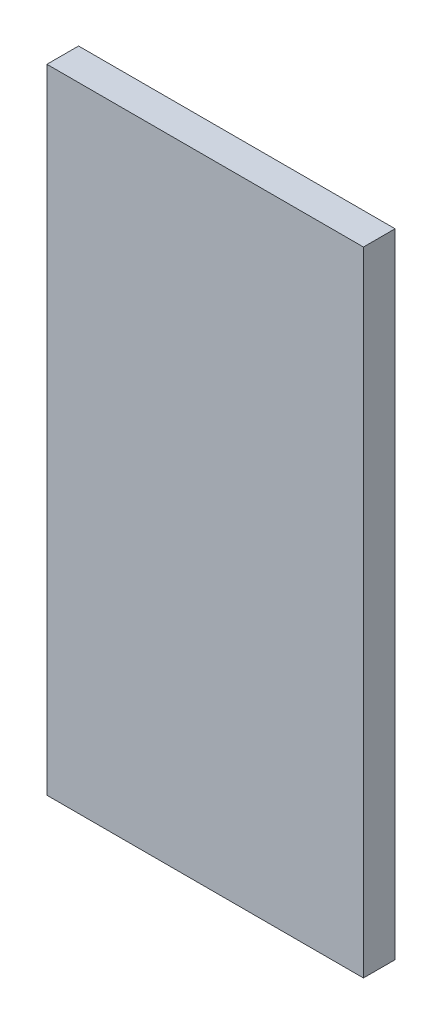
ISO-10303-21;
HEADER;
FILE_DESCRIPTION(('STEP AP214'),'2;1');
FILE_NAME('part.step','',(''),(''),'','','');
FILE_SCHEMA(('AUTOMOTIVE_DESIGN { 1 0 10303 214 1 1 1 1 }'));
ENDSEC;
DATA;
#1=APPLICATION_CONTEXT('core data for automotive mechanical design processes');
#2=APPLICATION_PROTOCOL_DEFINITION('international standard','automotive_design',2000,#1);
#3=PRODUCT_CONTEXT('',#1,'mechanical');
#4=PRODUCT('Part','Part','',(#3));
#5=PRODUCT_RELATED_PRODUCT_CATEGORY('part','',(#4));
#6=PRODUCT_DEFINITION_FORMATION('','',#4);
#7=PRODUCT_DEFINITION_CONTEXT('part definition',#1,'design');
#8=PRODUCT_DEFINITION('design','',#6,#7);
#9=PRODUCT_DEFINITION_SHAPE('','',#8);
#10=(LENGTH_UNIT() NAMED_UNIT(*) SI_UNIT(.MILLI.,.METRE.));
#11=(NAMED_UNIT(*) PLANE_ANGLE_UNIT() SI_UNIT($,.RADIAN.));
#12=(NAMED_UNIT(*) SI_UNIT($,.STERADIAN.) SOLID_ANGLE_UNIT());
#13=UNCERTAINTY_MEASURE_WITH_UNIT(LENGTH_MEASURE(1.E-05),#10,'distance_accuracy_value','');
#14=(GEOMETRIC_REPRESENTATION_CONTEXT(3) GLOBAL_UNCERTAINTY_ASSIGNED_CONTEXT((#13)) GLOBAL_UNIT_ASSIGNED_CONTEXT((#10,
#11,#12)) REPRESENTATION_CONTEXT('',''));
#15=CARTESIAN_POINT('',(0.,0.,0.));
#16=DIRECTION('',(0.,0.,1.));
#17=DIRECTION('',(1.,0.,0.));
#18=AXIS2_PLACEMENT_3D('',#15,#16,#17);
#19=CARTESIAN_POINT('',(-17.3754965835056,575.752105514063,30.));
#20=DIRECTION('',(1.,0.,0.));
#21=DIRECTION('',(0.,1.,0.));
#22=AXIS2_PLACEMENT_3D('',#19,#20,#21);
#23=PLANE('',#22);
#24=DIRECTION('',(0.,-1.,0.));
#25=VECTOR('',#24,1.);
#26=CARTESIAN_POINT('',(-17.3754965835056,575.752105514063,0.));
#27=LINE('',#26,#25);
#28=CARTESIAN_POINT('',(-17.3754965835056,575.752105514063,0.));
#29=VERTEX_POINT('',#28);
#30=CARTESIAN_POINT('',(-17.3754965835055,-24.2478944859368,0.));
#31=VERTEX_POINT('',#30);
#32=EDGE_CURVE('E98',#29,#31,#27,.T.);
#33=ORIENTED_EDGE('',*,*,#32,.T.);
#34=DIRECTION('',(0.,0.,-1.));
#35=VECTOR('',#34,1.);
#36=CARTESIAN_POINT('',(-17.3754965835055,-24.2478944859368,30.));
#37=LINE('',#36,#35);
#38=CARTESIAN_POINT('',(-17.3754965835055,-24.2478944859368,30.));
#39=VERTEX_POINT('',#38);
#40=EDGE_CURVE('E11',#39,#31,#37,.T.);
#41=ORIENTED_EDGE('',*,*,#40,.F.);
#42=DIRECTION('',(0.,-1.,0.));
#43=VECTOR('',#42,1.);
#44=CARTESIAN_POINT('',(-17.3754965835056,575.752105514063,30.));
#45=LINE('',#44,#43);
#46=CARTESIAN_POINT('',(-17.3754965835056,575.752105514063,30.));
#47=VERTEX_POINT('',#46);
#48=EDGE_CURVE('E86',#47,#39,#45,.T.);
#49=ORIENTED_EDGE('',*,*,#48,.F.);
#50=DIRECTION('',(0.,0.,-1.));
#51=VECTOR('',#50,1.);
#52=CARTESIAN_POINT('',(-17.3754965835056,575.752105514063,30.));
#53=LINE('',#52,#51);
#54=EDGE_CURVE('E94',#47,#29,#53,.T.);
#55=ORIENTED_EDGE('',*,*,#54,.T.);
#56=EDGE_LOOP('',(#33,#41,#49,#55));
#57=FACE_BOUND('',#56,.T.);
#58=ADVANCED_FACE('F35',(#57),#23,.F.);
#59=CARTESIAN_POINT('',(-17.3754965835055,-24.2478944859368,30.));
#60=DIRECTION('',(0.,1.,0.));
#61=DIRECTION('',(0.,0.,1.));
#62=AXIS2_PLACEMENT_3D('',#59,#60,#61);
#63=PLANE('',#62);
#64=DIRECTION('',(1.,0.,0.));
#65=VECTOR('',#64,1.);
#66=CARTESIAN_POINT('',(-17.3754965835055,-24.2478944859368,0.));
#67=LINE('',#66,#65);
#68=CARTESIAN_POINT('',(282.624503416494,-24.2478944859368,0.));
#69=VERTEX_POINT('',#68);
#70=EDGE_CURVE('E90',#31,#69,#67,.T.);
#71=ORIENTED_EDGE('',*,*,#70,.T.);
#72=DIRECTION('',(0.,0.,-1.));
#73=VECTOR('',#72,1.);
#74=CARTESIAN_POINT('',(282.624503416494,-24.2478944859368,30.));
#75=LINE('',#74,#73);
#76=CARTESIAN_POINT('',(282.624503416494,-24.2478944859368,30.));
#77=VERTEX_POINT('',#76);
#78=EDGE_CURVE('E43',#77,#69,#75,.T.);
#79=ORIENTED_EDGE('',*,*,#78,.F.);
#80=DIRECTION('',(1.,0.,0.));
#81=VECTOR('',#80,1.);
#82=CARTESIAN_POINT('',(-17.3754965835055,-24.2478944859368,30.));
#83=LINE('',#82,#81);
#84=EDGE_CURVE('E81',#39,#77,#83,.T.);
#85=ORIENTED_EDGE('',*,*,#84,.F.);
#86=ORIENTED_EDGE('',*,*,#40,.T.);
#87=EDGE_LOOP('',(#71,#79,#85,#86));
#88=FACE_BOUND('',#87,.T.);
#89=ADVANCED_FACE('F89',(#88),#63,.F.);
#90=CARTESIAN_POINT('',(282.624503416494,575.752105514063,30.));
#91=DIRECTION('',(-1.,0.,0.));
#92=DIRECTION('',(0.,-1.,0.));
#93=AXIS2_PLACEMENT_3D('',#90,#91,#92);
#94=PLANE('',#93);
#95=DIRECTION('',(0.,1.,0.));
#96=VECTOR('',#95,1.);
#97=CARTESIAN_POINT('',(282.624503416494,575.752105514063,0.));
#98=LINE('',#97,#96);
#99=CARTESIAN_POINT('',(282.624503416494,575.752105514063,0.));
#100=VERTEX_POINT('',#99);
#101=EDGE_CURVE('E68',#69,#100,#98,.T.);
#102=ORIENTED_EDGE('',*,*,#101,.T.);
#103=DIRECTION('',(0.,0.,-1.));
#104=VECTOR('',#103,1.);
#105=CARTESIAN_POINT('',(282.624503416494,575.752105514063,30.));
#106=LINE('',#105,#104);
#107=CARTESIAN_POINT('',(282.624503416494,575.752105514063,30.));
#108=VERTEX_POINT('',#107);
#109=EDGE_CURVE('E91',#108,#100,#106,.T.);
#110=ORIENTED_EDGE('',*,*,#109,.F.);
#111=DIRECTION('',(0.,1.,0.));
#112=VECTOR('',#111,1.);
#113=CARTESIAN_POINT('',(282.624503416494,575.752105514063,30.));
#114=LINE('',#113,#112);
#115=EDGE_CURVE('E84',#77,#108,#114,.T.);
#116=ORIENTED_EDGE('',*,*,#115,.F.);
#117=ORIENTED_EDGE('',*,*,#78,.T.);
#118=EDGE_LOOP('',(#102,#110,#116,#117));
#119=FACE_BOUND('',#118,.T.);
#120=ADVANCED_FACE('F92',(#119),#94,.F.);
#121=CARTESIAN_POINT('',(-17.3754965835056,575.752105514063,30.));
#122=DIRECTION('',(0.,-1.,0.));
#123=DIRECTION('',(0.,0.,-1.));
#124=AXIS2_PLACEMENT_3D('',#121,#122,#123);
#125=PLANE('',#124);
#126=DIRECTION('',(-1.,0.,0.));
#127=VECTOR('',#126,1.);
#128=CARTESIAN_POINT('',(-17.3754965835056,575.752105514063,0.));
#129=LINE('',#128,#127);
#130=EDGE_CURVE('E74',#100,#29,#129,.T.);
#131=ORIENTED_EDGE('',*,*,#130,.T.);
#132=ORIENTED_EDGE('',*,*,#54,.F.);
#133=DIRECTION('',(-1.,0.,0.));
#134=VECTOR('',#133,1.);
#135=CARTESIAN_POINT('',(-17.3754965835056,575.752105514063,30.));
#136=LINE('',#135,#134);
#137=EDGE_CURVE('E51',#108,#47,#136,.T.);
#138=ORIENTED_EDGE('',*,*,#137,.F.);
#139=ORIENTED_EDGE('',*,*,#109,.T.);
#140=EDGE_LOOP('',(#131,#132,#138,#139));
#141=FACE_BOUND('',#140,.T.);
#142=ADVANCED_FACE('F105',(#141),#125,.F.);
#143=CARTESIAN_POINT('',(0.,0.,30.));
#144=DIRECTION('',(0.,0.,1.));
#145=DIRECTION('',(1.,0.,0.));
#146=AXIS2_PLACEMENT_3D('',#143,#144,#145);
#147=PLANE('',#146);
#148=ORIENTED_EDGE('',*,*,#48,.T.);
#149=ORIENTED_EDGE('',*,*,#84,.T.);
#150=ORIENTED_EDGE('',*,*,#115,.T.);
#151=ORIENTED_EDGE('',*,*,#137,.T.);
#152=EDGE_LOOP('',(#148,#149,#150,#151));
#153=FACE_BOUND('',#152,.T.);
#154=ADVANCED_FACE('F82',(#153),#147,.T.);
#155=CARTESIAN_POINT('',(0.,0.,0.));
#156=DIRECTION('',(0.,0.,1.));
#157=DIRECTION('',(1.,0.,0.));
#158=AXIS2_PLACEMENT_3D('',#155,#156,#157);
#159=PLANE('',#158);
#160=ORIENTED_EDGE('',*,*,#32,.F.);
#161=ORIENTED_EDGE('',*,*,#130,.F.);
#162=ORIENTED_EDGE('',*,*,#101,.F.);
#163=ORIENTED_EDGE('',*,*,#70,.F.);
#164=EDGE_LOOP('',(#160,#161,#162,#163));
#165=FACE_BOUND('',#164,.T.);
#166=ADVANCED_FACE('F108',(#165),#159,.F.);
#167=CLOSED_SHELL('',(#58,#89,#120,#142,#154,#166));
#168=MANIFOLD_SOLID_BREP('B2',#167);
#169=ADVANCED_BREP_SHAPE_REPRESENTATION('',(#18,#168),#14);
#170=SHAPE_DEFINITION_REPRESENTATION(#9,#169);
ENDSEC;
END-ISO-10303-21;
